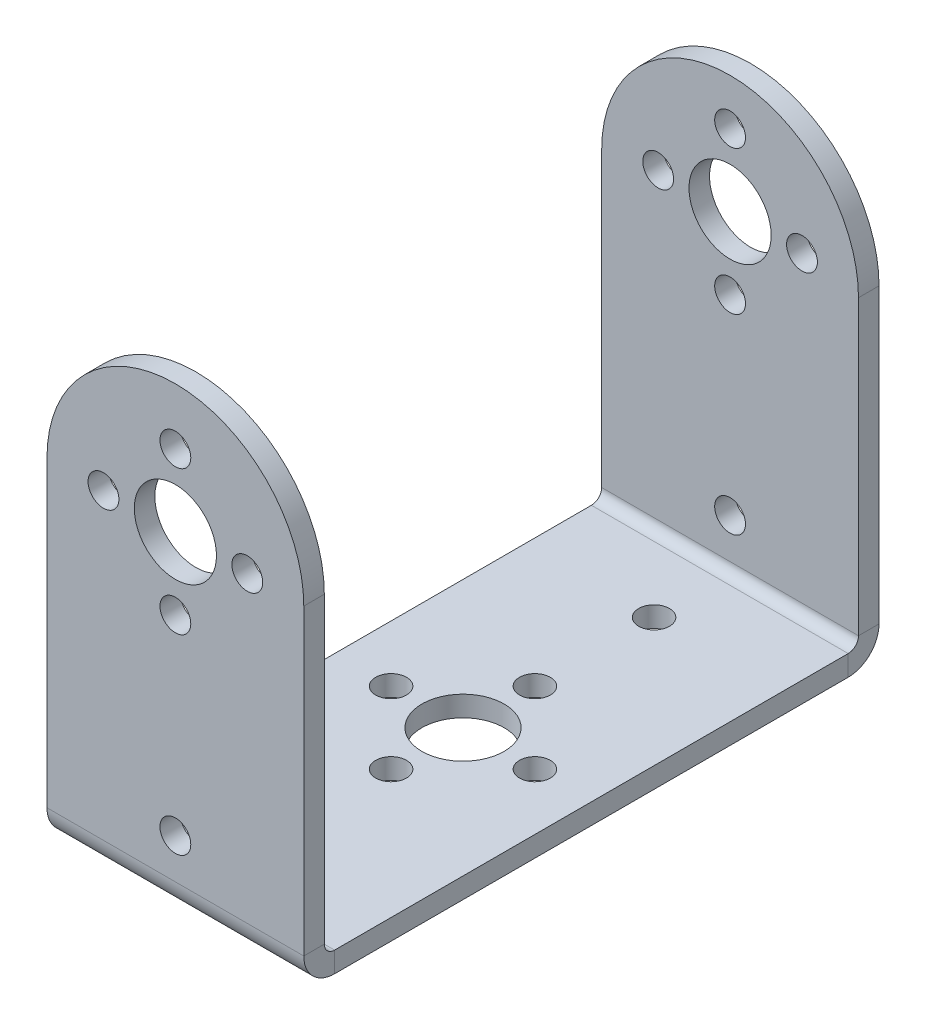
ISO-10303-21;
HEADER;
FILE_DESCRIPTION(('STEP AP214'),'2;1');
FILE_NAME('part.step','',(''),(''),'','','');
FILE_SCHEMA(('AUTOMOTIVE_DESIGN { 1 0 10303 214 1 1 1 1 }'));
ENDSEC;
DATA;
#1=APPLICATION_CONTEXT('core data for automotive mechanical design processes');
#2=APPLICATION_PROTOCOL_DEFINITION('international standard','automotive_design',2000,#1);
#3=PRODUCT_CONTEXT('',#1,'mechanical');
#4=PRODUCT('Part','Part','',(#3));
#5=PRODUCT_RELATED_PRODUCT_CATEGORY('part','',(#4));
#6=PRODUCT_DEFINITION_FORMATION('','',#4);
#7=PRODUCT_DEFINITION_CONTEXT('part definition',#1,'design');
#8=PRODUCT_DEFINITION('design','',#6,#7);
#9=PRODUCT_DEFINITION_SHAPE('','',#8);
#10=(LENGTH_UNIT() NAMED_UNIT(*) SI_UNIT(.MILLI.,.METRE.));
#11=(NAMED_UNIT(*) PLANE_ANGLE_UNIT() SI_UNIT($,.RADIAN.));
#12=(NAMED_UNIT(*) SI_UNIT($,.STERADIAN.) SOLID_ANGLE_UNIT());
#13=UNCERTAINTY_MEASURE_WITH_UNIT(LENGTH_MEASURE(1.E-05),#10,'distance_accuracy_value','');
#14=(GEOMETRIC_REPRESENTATION_CONTEXT(3) GLOBAL_UNCERTAINTY_ASSIGNED_CONTEXT((#13)) GLOBAL_UNIT_ASSIGNED_CONTEXT((#10,
#11,#12)) REPRESENTATION_CONTEXT('',''));
#15=CARTESIAN_POINT('',(0.,0.,0.));
#16=DIRECTION('',(0.,0.,1.));
#17=DIRECTION('',(1.,0.,0.));
#18=AXIS2_PLACEMENT_3D('',#15,#16,#17);
#19=CARTESIAN_POINT('',(0.,-3.88666196166363E-13,-56.));
#20=DIRECTION('',(0.,0.,1.));
#21=DIRECTION('',(0.,-1.,0.));
#22=AXIS2_PLACEMENT_3D('',#19,#20,#21);
#23=PLANE('',#22);
#24=CARTESIAN_POINT('',(0.,36.5,-56.0000000000004));
#25=DIRECTION('',(0.,0.,1.));
#26=DIRECTION('',(1.,0.,0.));
#27=AXIS2_PLACEMENT_3D('',#24,#25,#26);
#28=CIRCLE('',#27,1.49999999999999);
#29=CARTESIAN_POINT('',(1.49999999999999,36.5,-56.0000000000004));
#30=VERTEX_POINT('',#29);
#31=EDGE_CURVE('E428',#30,#30,#28,.T.);
#32=ORIENTED_EDGE('',*,*,#31,.T.);
#33=EDGE_LOOP('',(#32));
#34=FACE_BOUND('',#33,.T.);
#35=CARTESIAN_POINT('',(-7.,29.5,-56.0000000000004));
#36=DIRECTION('',(0.,0.,1.));
#37=DIRECTION('',(1.,0.,0.));
#38=AXIS2_PLACEMENT_3D('',#35,#36,#37);
#39=CIRCLE('',#38,1.49999999999999);
#40=CARTESIAN_POINT('',(-5.50000000000001,29.5,-56.0000000000004));
#41=VERTEX_POINT('',#40);
#42=EDGE_CURVE('E412',#41,#41,#39,.T.);
#43=ORIENTED_EDGE('',*,*,#42,.T.);
#44=EDGE_LOOP('',(#43));
#45=FACE_BOUND('',#44,.T.);
#46=CARTESIAN_POINT('',(0.,22.5,-56.0000000000004));
#47=DIRECTION('',(0.,0.,1.));
#48=DIRECTION('',(1.,0.,0.));
#49=AXIS2_PLACEMENT_3D('',#46,#47,#48);
#50=CIRCLE('',#49,1.49999999999999);
#51=CARTESIAN_POINT('',(1.49999999999999,22.5,-56.0000000000004));
#52=VERTEX_POINT('',#51);
#53=EDGE_CURVE('E396',#52,#52,#50,.T.);
#54=ORIENTED_EDGE('',*,*,#53,.T.);
#55=EDGE_LOOP('',(#54));
#56=FACE_BOUND('',#55,.T.);
#57=CARTESIAN_POINT('',(7.,29.5,-56.0000000000004));
#58=DIRECTION('',(0.,0.,1.));
#59=DIRECTION('',(1.,0.,0.));
#60=AXIS2_PLACEMENT_3D('',#57,#58,#59);
#61=CIRCLE('',#60,1.49999999999999);
#62=CARTESIAN_POINT('',(8.49999999999999,29.5,-56.0000000000004));
#63=VERTEX_POINT('',#62);
#64=EDGE_CURVE('E380',#63,#63,#61,.T.);
#65=ORIENTED_EDGE('',*,*,#64,.T.);
#66=EDGE_LOOP('',(#65));
#67=FACE_BOUND('',#66,.T.);
#68=CARTESIAN_POINT('',(0.,3.9,-56.0000000000004));
#69=DIRECTION('',(0.,0.,1.));
#70=DIRECTION('',(1.,0.,0.));
#71=AXIS2_PLACEMENT_3D('',#68,#69,#70);
#72=CIRCLE('',#71,1.49999999999999);
#73=CARTESIAN_POINT('',(1.49999999999999,3.9,-56.0000000000004));
#74=VERTEX_POINT('',#73);
#75=EDGE_CURVE('E364',#74,#74,#72,.T.);
#76=ORIENTED_EDGE('',*,*,#75,.T.);
#77=EDGE_LOOP('',(#76));
#78=FACE_BOUND('',#77,.T.);
#79=CARTESIAN_POINT('',(0.,29.5,-56.0000000000003));
#80=DIRECTION('',(0.,0.,1.));
#81=DIRECTION('',(1.,0.,0.));
#82=AXIS2_PLACEMENT_3D('',#79,#80,#81);
#83=CIRCLE('',#82,4.);
#84=CARTESIAN_POINT('',(4.,29.5,-56.0000000000003));
#85=VERTEX_POINT('',#84);
#86=EDGE_CURVE('E348',#85,#85,#83,.T.);
#87=ORIENTED_EDGE('',*,*,#86,.T.);
#88=EDGE_LOOP('',(#87));
#89=FACE_BOUND('',#88,.T.);
#90=DIRECTION('',(0.,1.,0.));
#91=VECTOR('',#90,1.);
#92=CARTESIAN_POINT('',(-12.5,40.9999999999998,-56.0000000000003));
#93=LINE('',#92,#91);
#94=CARTESIAN_POINT('',(-12.5,-1.73384210050123E-13,-56.));
#95=VERTEX_POINT('',#94);
#96=CARTESIAN_POINT('',(-12.5,28.4999999999998,-56.0000000000002));
#97=VERTEX_POINT('',#96);
#98=EDGE_CURVE('E297',#95,#97,#93,.T.);
#99=ORIENTED_EDGE('',*,*,#98,.T.);
#100=CARTESIAN_POINT('',(0.,28.4999999999998,-56.0000000000002));
#101=DIRECTION('',(0.,0.,1.));
#102=DIRECTION('',(0.,-1.,0.));
#103=AXIS2_PLACEMENT_3D('',#100,#101,#102);
#104=CIRCLE('',#103,12.5);
#105=CARTESIAN_POINT('',(12.5,28.4999999999998,-56.0000000000002));
#106=VERTEX_POINT('',#105);
#107=EDGE_CURVE('E328',#106,#97,#104,.T.);
#108=ORIENTED_EDGE('',*,*,#107,.F.);
#109=DIRECTION('',(0.,-1.,0.));
#110=VECTOR('',#109,1.);
#111=CARTESIAN_POINT('',(12.5,-1.00000000000019,-56.));
#112=LINE('',#111,#110);
#113=CARTESIAN_POINT('',(12.5,-2.15149779794903E-13,-56.));
#114=VERTEX_POINT('',#113);
#115=EDGE_CURVE('E277',#106,#114,#112,.T.);
#116=ORIENTED_EDGE('',*,*,#115,.T.);
#117=DIRECTION('',(1.,0.,0.));
#118=VECTOR('',#117,1.);
#119=CARTESIAN_POINT('',(0.,-1.73384210050123E-13,-56.));
#120=LINE('',#119,#118);
#121=EDGE_CURVE('E302',#95,#114,#120,.T.);
#122=ORIENTED_EDGE('',*,*,#121,.F.);
#123=EDGE_LOOP('',(#99,#108,#116,#122));
#124=FACE_BOUND('',#123,.T.);
#125=ADVANCED_FACE('F83',(#34,#45,#56,#67,#78,#89,#124),#23,.F.);
#126=CARTESIAN_POINT('',(0.,-3.7470027081099E-13,-54.));
#127=DIRECTION('',(0.,0.,1.));
#128=DIRECTION('',(0.,-1.,0.));
#129=AXIS2_PLACEMENT_3D('',#126,#127,#128);
#130=PLANE('',#129);
#131=CARTESIAN_POINT('',(0.,36.5,-54.0000000000003));
#132=DIRECTION('',(0.,0.,1.));
#133=DIRECTION('',(0.,-1.,0.));
#134=AXIS2_PLACEMENT_3D('',#131,#132,#133);
#135=CIRCLE('',#134,1.49999999999999);
#136=CARTESIAN_POINT('',(0.,35.,-54.0000000000003));
#137=VERTEX_POINT('',#136);
#138=EDGE_CURVE('E420',#137,#137,#135,.T.);
#139=ORIENTED_EDGE('',*,*,#138,.F.);
#140=EDGE_LOOP('',(#139));
#141=FACE_BOUND('',#140,.T.);
#142=CARTESIAN_POINT('',(-7.,29.5,-54.0000000000002));
#143=DIRECTION('',(0.,0.,1.));
#144=DIRECTION('',(0.,-1.,0.));
#145=AXIS2_PLACEMENT_3D('',#142,#143,#144);
#146=CIRCLE('',#145,1.49999999999999);
#147=CARTESIAN_POINT('',(-7.,28.,-54.0000000000002));
#148=VERTEX_POINT('',#147);
#149=EDGE_CURVE('E404',#148,#148,#146,.T.);
#150=ORIENTED_EDGE('',*,*,#149,.F.);
#151=EDGE_LOOP('',(#150));
#152=FACE_BOUND('',#151,.T.);
#153=CARTESIAN_POINT('',(0.,22.5,-54.0000000000002));
#154=DIRECTION('',(0.,0.,1.));
#155=DIRECTION('',(0.,-1.,0.));
#156=AXIS2_PLACEMENT_3D('',#153,#154,#155);
#157=CIRCLE('',#156,1.49999999999999);
#158=CARTESIAN_POINT('',(0.,21.,-54.0000000000002));
#159=VERTEX_POINT('',#158);
#160=EDGE_CURVE('E388',#159,#159,#157,.T.);
#161=ORIENTED_EDGE('',*,*,#160,.F.);
#162=EDGE_LOOP('',(#161));
#163=FACE_BOUND('',#162,.T.);
#164=CARTESIAN_POINT('',(7.,29.5,-54.0000000000002));
#165=DIRECTION('',(0.,0.,1.));
#166=DIRECTION('',(0.,-1.,0.));
#167=AXIS2_PLACEMENT_3D('',#164,#165,#166);
#168=CIRCLE('',#167,1.49999999999999);
#169=CARTESIAN_POINT('',(7.,28.,-54.0000000000002));
#170=VERTEX_POINT('',#169);
#171=EDGE_CURVE('E372',#170,#170,#168,.T.);
#172=ORIENTED_EDGE('',*,*,#171,.F.);
#173=EDGE_LOOP('',(#172));
#174=FACE_BOUND('',#173,.T.);
#175=CARTESIAN_POINT('',(0.,3.9,-54.));
#176=DIRECTION('',(0.,0.,1.));
#177=DIRECTION('',(0.,-1.,0.));
#178=AXIS2_PLACEMENT_3D('',#175,#176,#177);
#179=CIRCLE('',#178,1.49999999999999);
#180=CARTESIAN_POINT('',(0.,2.40000000000002,-54.));
#181=VERTEX_POINT('',#180);
#182=EDGE_CURVE('E353',#181,#181,#179,.T.);
#183=ORIENTED_EDGE('',*,*,#182,.F.);
#184=EDGE_LOOP('',(#183));
#185=FACE_BOUND('',#184,.T.);
#186=CARTESIAN_POINT('',(0.,29.5,-54.0000000000002));
#187=DIRECTION('',(0.,0.,1.));
#188=DIRECTION('',(0.,-1.,0.));
#189=AXIS2_PLACEMENT_3D('',#186,#187,#188);
#190=CIRCLE('',#189,4.);
#191=CARTESIAN_POINT('',(0.,25.5,-54.0000000000002));
#192=VERTEX_POINT('',#191);
#193=EDGE_CURVE('E340',#192,#192,#190,.T.);
#194=ORIENTED_EDGE('',*,*,#193,.F.);
#195=EDGE_LOOP('',(#194));
#196=FACE_BOUND('',#195,.T.);
#197=CARTESIAN_POINT('',(0.,28.4999999999998,-54.0000000000002));
#198=DIRECTION('',(0.,0.,1.));
#199=DIRECTION('',(0.,-1.,0.));
#200=AXIS2_PLACEMENT_3D('',#197,#198,#199);
#201=CIRCLE('',#200,12.5);
#202=CARTESIAN_POINT('',(12.5,28.4999999999998,-54.0000000000002));
#203=VERTEX_POINT('',#202);
#204=CARTESIAN_POINT('',(-12.5,28.4999999999998,-54.0000000000001));
#205=VERTEX_POINT('',#204);
#206=EDGE_CURVE('E329',#203,#205,#201,.T.);
#207=ORIENTED_EDGE('',*,*,#206,.T.);
#208=DIRECTION('',(0.,1.,0.));
#209=VECTOR('',#208,1.);
#210=CARTESIAN_POINT('',(-12.5,40.9999999999998,-54.0000000000003));
#211=LINE('',#210,#209);
#212=CARTESIAN_POINT('',(-12.5,-2.01271991987089E-13,-54.));
#213=VERTEX_POINT('',#212);
#214=EDGE_CURVE('E298',#213,#205,#211,.T.);
#215=ORIENTED_EDGE('',*,*,#214,.F.);
#216=DIRECTION('',(-1.,0.,0.));
#217=VECTOR('',#216,1.);
#218=CARTESIAN_POINT('',(12.5,-1.87350135405495E-13,-54.));
#219=LINE('',#218,#217);
#220=CARTESIAN_POINT('',(12.5,-2.01271991987089E-13,-54.));
#221=VERTEX_POINT('',#220);
#222=EDGE_CURVE('E317',#221,#213,#219,.T.);
#223=ORIENTED_EDGE('',*,*,#222,.F.);
#224=DIRECTION('',(0.,-1.,0.));
#225=VECTOR('',#224,1.);
#226=CARTESIAN_POINT('',(12.5,-1.00000000000018,-54.));
#227=LINE('',#226,#225);
#228=EDGE_CURVE('E293',#203,#221,#227,.T.);
#229=ORIENTED_EDGE('',*,*,#228,.F.);
#230=EDGE_LOOP('',(#207,#215,#223,#229));
#231=FACE_BOUND('',#230,.T.);
#232=ADVANCED_FACE('F550',(#141,#152,#163,#174,#185,#196,#231),#130,.T.);
#233=CARTESIAN_POINT('',(-12.5,40.9999999999998,-56.0000000000003));
#234=DIRECTION('',(1.,0.,0.));
#235=DIRECTION('',(0.,1.,0.));
#236=AXIS2_PLACEMENT_3D('',#233,#234,#235);
#237=PLANE('',#236);
#238=DIRECTION('',(0.,0.,1.));
#239=VECTOR('',#238,1.);
#240=CARTESIAN_POINT('',(-12.5,28.4999999999998,-54.0000000000001));
#241=LINE('',#240,#239);
#242=EDGE_CURVE('E333',#205,#97,#241,.F.);
#243=ORIENTED_EDGE('',*,*,#242,.T.);
#244=ORIENTED_EDGE('',*,*,#98,.F.);
#245=DIRECTION('',(0.,0.,-1.));
#246=VECTOR('',#245,1.);
#247=CARTESIAN_POINT('',(-12.5,-1.87350135405495E-13,-54.));
#248=LINE('',#247,#246);
#249=EDGE_CURVE('E312',#213,#95,#248,.T.);
#250=ORIENTED_EDGE('',*,*,#249,.F.);
#251=ORIENTED_EDGE('',*,*,#214,.T.);
#252=EDGE_LOOP('',(#243,#244,#250,#251));
#253=FACE_BOUND('',#252,.T.);
#254=ADVANCED_FACE('F556',(#253),#237,.F.);
#255=CARTESIAN_POINT('',(-12.5,-3.00000000000018,-54.));
#256=DIRECTION('',(1.,0.,0.));
#257=DIRECTION('',(0.,0.,-1.));
#258=AXIS2_PLACEMENT_3D('',#255,#256,#257);
#259=PLANE('',#258);
#260=DIRECTION('',(0.,-1.,0.));
#261=VECTOR('',#260,1.);
#262=CARTESIAN_POINT('',(-12.5,-1.0000000000002,-53.));
#263=LINE('',#262,#261);
#264=CARTESIAN_POINT('',(-12.5,-1.00000000000017,-53.));
#265=VERTEX_POINT('',#264);
#266=CARTESIAN_POINT('',(-12.5,-3.0000000000002,-53.));
#267=VERTEX_POINT('',#266);
#268=EDGE_CURVE('E258',#265,#267,#263,.T.);
#269=ORIENTED_EDGE('',*,*,#268,.T.);
#270=DIRECTION('',(0.,0.,-1.));
#271=VECTOR('',#270,1.);
#272=CARTESIAN_POINT('',(-12.5,-2.99999999999999,0.));
#273=LINE('',#272,#271);
#274=CARTESIAN_POINT('',(-12.5,-3.,-2.99999999999999));
#275=VERTEX_POINT('',#274);
#276=EDGE_CURVE('E246',#275,#267,#273,.T.);
#277=ORIENTED_EDGE('',*,*,#276,.F.);
#278=DIRECTION('',(0.,1.,0.));
#279=VECTOR('',#278,1.);
#280=CARTESIAN_POINT('',(-12.5,-1.,-3.));
#281=LINE('',#280,#279);
#282=CARTESIAN_POINT('',(-12.5,-1.,-3.));
#283=VERTEX_POINT('',#282);
#284=EDGE_CURVE('E187',#283,#275,#281,.F.);
#285=ORIENTED_EDGE('',*,*,#284,.F.);
#286=DIRECTION('',(0.,0.,1.));
#287=VECTOR('',#286,1.);
#288=CARTESIAN_POINT('',(-12.5,-1.00000000000018,-54.));
#289=LINE('',#288,#287);
#290=EDGE_CURVE('E249',#283,#265,#289,.F.);
#291=ORIENTED_EDGE('',*,*,#290,.T.);
#292=EDGE_LOOP('',(#269,#277,#285,#291));
#293=FACE_BOUND('',#292,.T.);
#294=ADVANCED_FACE('F585',(#293),#259,.F.);
#295=CARTESIAN_POINT('',(12.5,-3.,-1.99999999999999));
#296=DIRECTION('',(-1.,0.,0.));
#297=DIRECTION('',(0.,0.,1.));
#298=AXIS2_PLACEMENT_3D('',#295,#296,#297);
#299=PLANE('',#298);
#300=DIRECTION('',(0.,-1.,0.));
#301=VECTOR('',#300,1.);
#302=CARTESIAN_POINT('',(12.5,-1.0000000000002,-53.));
#303=LINE('',#302,#301);
#304=CARTESIAN_POINT('',(12.5,-1.0000000000002,-53.));
#305=VERTEX_POINT('',#304);
#306=CARTESIAN_POINT('',(12.5,-3.00000000000018,-53.));
#307=VERTEX_POINT('',#306);
#308=EDGE_CURVE('E254',#305,#307,#303,.T.);
#309=ORIENTED_EDGE('',*,*,#308,.F.);
#310=DIRECTION('',(0.,0.,-1.));
#311=VECTOR('',#310,1.);
#312=CARTESIAN_POINT('',(12.5,-0.999999999999997,-2.));
#313=LINE('',#312,#311);
#314=CARTESIAN_POINT('',(12.5,-1.,-3.));
#315=VERTEX_POINT('',#314);
#316=EDGE_CURVE('E227',#305,#315,#313,.F.);
#317=ORIENTED_EDGE('',*,*,#316,.T.);
#318=DIRECTION('',(0.,1.,0.));
#319=VECTOR('',#318,1.);
#320=CARTESIAN_POINT('',(12.5,-3.,-2.99999999999999));
#321=LINE('',#320,#319);
#322=CARTESIAN_POINT('',(12.5,-3.,-2.99999999999999));
#323=VERTEX_POINT('',#322);
#324=EDGE_CURVE('E217',#315,#323,#321,.F.);
#325=ORIENTED_EDGE('',*,*,#324,.T.);
#326=DIRECTION('',(0.,0.,1.));
#327=VECTOR('',#326,1.);
#328=CARTESIAN_POINT('',(12.5,-2.99999999999999,0.));
#329=LINE('',#328,#327);
#330=EDGE_CURVE('E201',#307,#323,#329,.T.);
#331=ORIENTED_EDGE('',*,*,#330,.F.);
#332=EDGE_LOOP('',(#309,#317,#325,#331));
#333=FACE_BOUND('',#332,.T.);
#334=ADVANCED_FACE('F251',(#333),#299,.F.);
#335=CARTESIAN_POINT('',(0.,-2.99999999999999,0.));
#336=DIRECTION('',(0.,1.,0.));
#337=DIRECTION('',(0.,0.,1.));
#338=AXIS2_PLACEMENT_3D('',#335,#336,#337);
#339=PLANE('',#338);
#340=CARTESIAN_POINT('',(7.,-3.00000000000037,-28.));
#341=DIRECTION('',(0.,1.,0.));
#342=DIRECTION('',(0.,0.,1.));
#343=AXIS2_PLACEMENT_3D('',#340,#341,#342);
#344=CIRCLE('',#343,1.5);
#345=CARTESIAN_POINT('',(7.,-3.00000000000036,-26.5));
#346=VERTEX_POINT('',#345);
#347=EDGE_CURVE('E484',#346,#346,#344,.T.);
#348=ORIENTED_EDGE('',*,*,#347,.T.);
#349=EDGE_LOOP('',(#348));
#350=FACE_BOUND('',#349,.T.);
#351=CARTESIAN_POINT('',(-7.,-3.00000000000037,-28.));
#352=DIRECTION('',(0.,1.,0.));
#353=DIRECTION('',(0.,0.,1.));
#354=AXIS2_PLACEMENT_3D('',#351,#352,#353);
#355=CIRCLE('',#354,1.5);
#356=CARTESIAN_POINT('',(-7.,-3.00000000000036,-26.5));
#357=VERTEX_POINT('',#356);
#358=EDGE_CURVE('E476',#357,#357,#355,.T.);
#359=ORIENTED_EDGE('',*,*,#358,.T.);
#360=EDGE_LOOP('',(#359));
#361=FACE_BOUND('',#360,.T.);
#362=CARTESIAN_POINT('',(0.,-3.00000000000039,-35.));
#363=DIRECTION('',(0.,1.,0.));
#364=DIRECTION('',(0.,0.,1.));
#365=AXIS2_PLACEMENT_3D('',#362,#363,#364);
#366=CIRCLE('',#365,1.5);
#367=CARTESIAN_POINT('',(0.,-3.00000000000039,-33.5));
#368=VERTEX_POINT('',#367);
#369=EDGE_CURVE('E468',#368,#368,#366,.T.);
#370=ORIENTED_EDGE('',*,*,#369,.T.);
#371=EDGE_LOOP('',(#370));
#372=FACE_BOUND('',#371,.T.);
#373=CARTESIAN_POINT('',(0.,-3.00000000000034,-21.));
#374=DIRECTION('',(0.,1.,0.));
#375=DIRECTION('',(0.,0.,1.));
#376=AXIS2_PLACEMENT_3D('',#373,#374,#375);
#377=CIRCLE('',#376,1.5);
#378=CARTESIAN_POINT('',(0.,-3.00000000000034,-19.5));
#379=VERTEX_POINT('',#378);
#380=EDGE_CURVE('E460',#379,#379,#377,.T.);
#381=ORIENTED_EDGE('',*,*,#380,.T.);
#382=EDGE_LOOP('',(#381));
#383=FACE_BOUND('',#382,.T.);
#384=CARTESIAN_POINT('',(0.,-3.0000000000003,-9.4));
#385=DIRECTION('',(0.,1.,0.));
#386=DIRECTION('',(0.,0.,1.));
#387=AXIS2_PLACEMENT_3D('',#384,#385,#386);
#388=CIRCLE('',#387,1.5);
#389=CARTESIAN_POINT('',(0.,-3.0000000000003,-7.9));
#390=VERTEX_POINT('',#389);
#391=EDGE_CURVE('E452',#390,#390,#388,.T.);
#392=ORIENTED_EDGE('',*,*,#391,.T.);
#393=EDGE_LOOP('',(#392));
#394=FACE_BOUND('',#393,.T.);
#395=CARTESIAN_POINT('',(0.,-3.00000000000043,-46.6));
#396=DIRECTION('',(0.,1.,0.));
#397=DIRECTION('',(0.,0.,1.));
#398=AXIS2_PLACEMENT_3D('',#395,#396,#397);
#399=CIRCLE('',#398,1.5);
#400=CARTESIAN_POINT('',(0.,-3.00000000000043,-45.1));
#401=VERTEX_POINT('',#400);
#402=EDGE_CURVE('E441',#401,#401,#399,.T.);
#403=ORIENTED_EDGE('',*,*,#402,.T.);
#404=EDGE_LOOP('',(#403));
#405=FACE_BOUND('',#404,.T.);
#406=CARTESIAN_POINT('',(0.,-3.00000000000029,-28.));
#407=DIRECTION('',(0.,1.,0.));
#408=DIRECTION('',(0.,0.,1.));
#409=AXIS2_PLACEMENT_3D('',#406,#407,#408);
#410=CIRCLE('',#409,4.);
#411=CARTESIAN_POINT('',(0.,-3.00000000000028,-24.));
#412=VERTEX_POINT('',#411);
#413=EDGE_CURVE('E436',#412,#412,#410,.T.);
#414=ORIENTED_EDGE('',*,*,#413,.T.);
#415=EDGE_LOOP('',(#414));
#416=FACE_BOUND('',#415,.T.);
#417=DIRECTION('',(-1.,0.,0.));
#418=VECTOR('',#417,1.);
#419=CARTESIAN_POINT('',(-12.5,-3.0000000000002,-53.));
#420=LINE('',#419,#418);
#421=EDGE_CURVE('E243',#267,#307,#420,.F.);
#422=ORIENTED_EDGE('',*,*,#421,.T.);
#423=ORIENTED_EDGE('',*,*,#330,.T.);
#424=DIRECTION('',(-1.,0.,0.));
#425=VECTOR('',#424,1.);
#426=CARTESIAN_POINT('',(12.5,-3.,-2.99999999999999));
#427=LINE('',#426,#425);
#428=EDGE_CURVE('E240',#275,#323,#427,.F.);
#429=ORIENTED_EDGE('',*,*,#428,.F.);
#430=ORIENTED_EDGE('',*,*,#276,.T.);
#431=EDGE_LOOP('',(#422,#423,#429,#430));
#432=FACE_BOUND('',#431,.T.);
#433=ADVANCED_FACE('F238',(#350,#361,#372,#383,#394,#405,#416,#432),#339,.F.);
#434=CARTESIAN_POINT('',(0.,-0.99999999999999,0.));
#435=DIRECTION('',(0.,1.,0.));
#436=DIRECTION('',(0.,0.,1.));
#437=AXIS2_PLACEMENT_3D('',#434,#435,#436);
#438=PLANE('',#437);
#439=CARTESIAN_POINT('',(7.,-1.00000000000009,-28.));
#440=DIRECTION('',(0.,1.,0.));
#441=DIRECTION('',(0.,0.,1.));
#442=AXIS2_PLACEMENT_3D('',#439,#440,#441);
#443=CIRCLE('',#442,1.49999999999999);
#444=CARTESIAN_POINT('',(7.,-1.00000000000008,-26.5));
#445=VERTEX_POINT('',#444);
#446=EDGE_CURVE('E488',#445,#445,#443,.T.);
#447=ORIENTED_EDGE('',*,*,#446,.F.);
#448=EDGE_LOOP('',(#447));
#449=FACE_BOUND('',#448,.T.);
#450=CARTESIAN_POINT('',(-7.,-1.00000000000009,-28.));
#451=DIRECTION('',(0.,1.,0.));
#452=DIRECTION('',(0.,0.,1.));
#453=AXIS2_PLACEMENT_3D('',#450,#451,#452);
#454=CIRCLE('',#453,1.49999999999999);
#455=CARTESIAN_POINT('',(-7.,-1.00000000000008,-26.5));
#456=VERTEX_POINT('',#455);
#457=EDGE_CURVE('E480',#456,#456,#454,.T.);
#458=ORIENTED_EDGE('',*,*,#457,.F.);
#459=EDGE_LOOP('',(#458));
#460=FACE_BOUND('',#459,.T.);
#461=CARTESIAN_POINT('',(0.,-1.00000000000011,-35.));
#462=DIRECTION('',(0.,1.,0.));
#463=DIRECTION('',(0.,0.,1.));
#464=AXIS2_PLACEMENT_3D('',#461,#462,#463);
#465=CIRCLE('',#464,1.49999999999999);
#466=CARTESIAN_POINT('',(0.,-1.00000000000011,-33.5));
#467=VERTEX_POINT('',#466);
#468=EDGE_CURVE('E472',#467,#467,#465,.T.);
#469=ORIENTED_EDGE('',*,*,#468,.F.);
#470=EDGE_LOOP('',(#469));
#471=FACE_BOUND('',#470,.T.);
#472=CARTESIAN_POINT('',(0.,-1.00000000000006,-21.));
#473=DIRECTION('',(0.,1.,0.));
#474=DIRECTION('',(0.,0.,1.));
#475=AXIS2_PLACEMENT_3D('',#472,#473,#474);
#476=CIRCLE('',#475,1.49999999999999);
#477=CARTESIAN_POINT('',(0.,-1.00000000000006,-19.5));
#478=VERTEX_POINT('',#477);
#479=EDGE_CURVE('E464',#478,#478,#476,.T.);
#480=ORIENTED_EDGE('',*,*,#479,.F.);
#481=EDGE_LOOP('',(#480));
#482=FACE_BOUND('',#481,.T.);
#483=CARTESIAN_POINT('',(0.,-1.00000000000002,-9.4));
#484=DIRECTION('',(0.,1.,0.));
#485=DIRECTION('',(0.,0.,1.));
#486=AXIS2_PLACEMENT_3D('',#483,#484,#485);
#487=CIRCLE('',#486,1.49999999999999);
#488=CARTESIAN_POINT('',(0.,-1.00000000000002,-7.90000000000001));
#489=VERTEX_POINT('',#488);
#490=EDGE_CURVE('E456',#489,#489,#487,.T.);
#491=ORIENTED_EDGE('',*,*,#490,.F.);
#492=EDGE_LOOP('',(#491));
#493=FACE_BOUND('',#492,.T.);
#494=CARTESIAN_POINT('',(0.,-1.00000000000015,-46.6));
#495=DIRECTION('',(0.,1.,0.));
#496=DIRECTION('',(0.,0.,1.));
#497=AXIS2_PLACEMENT_3D('',#494,#495,#496);
#498=CIRCLE('',#497,1.49999999999999);
#499=CARTESIAN_POINT('',(0.,-1.00000000000015,-45.1));
#500=VERTEX_POINT('',#499);
#501=EDGE_CURVE('E448',#500,#500,#498,.T.);
#502=ORIENTED_EDGE('',*,*,#501,.F.);
#503=EDGE_LOOP('',(#502));
#504=FACE_BOUND('',#503,.T.);
#505=CARTESIAN_POINT('',(0.,-1.00000000000009,-28.));
#506=DIRECTION('',(0.,1.,0.));
#507=DIRECTION('',(0.,0.,1.));
#508=AXIS2_PLACEMENT_3D('',#505,#506,#507);
#509=CIRCLE('',#508,4.);
#510=CARTESIAN_POINT('',(0.,-1.00000000000007,-24.));
#511=VERTEX_POINT('',#510);
#512=EDGE_CURVE('E437',#511,#511,#509,.T.);
#513=ORIENTED_EDGE('',*,*,#512,.F.);
#514=EDGE_LOOP('',(#513));
#515=FACE_BOUND('',#514,.T.);
#516=ORIENTED_EDGE('',*,*,#316,.F.);
#517=DIRECTION('',(-1.,0.,0.));
#518=VECTOR('',#517,1.);
#519=CARTESIAN_POINT('',(-12.5,-1.0000000000002,-53.));
#520=LINE('',#519,#518);
#521=EDGE_CURVE('E101',#265,#305,#520,.F.);
#522=ORIENTED_EDGE('',*,*,#521,.F.);
#523=ORIENTED_EDGE('',*,*,#290,.F.);
#524=DIRECTION('',(-1.,0.,0.));
#525=VECTOR('',#524,1.);
#526=CARTESIAN_POINT('',(12.5,-1.,-3.));
#527=LINE('',#526,#525);
#528=EDGE_CURVE('E253',#315,#283,#527,.T.);
#529=ORIENTED_EDGE('',*,*,#528,.F.);
#530=EDGE_LOOP('',(#516,#522,#523,#529));
#531=FACE_BOUND('',#530,.T.);
#532=ADVANCED_FACE('F495',(#449,#460,#471,#482,#493,#504,#515,#531),#438,.T.);
#533=CARTESIAN_POINT('',(-12.5,0.,-2.));
#534=DIRECTION('',(-1.,0.,0.));
#535=DIRECTION('',(0.,-1.,0.));
#536=AXIS2_PLACEMENT_3D('',#533,#534,#535);
#537=PLANE('',#536);
#538=DIRECTION('',(0.,-1.,0.));
#539=VECTOR('',#538,1.);
#540=CARTESIAN_POINT('',(-12.5,0.,0.));
#541=LINE('',#540,#539);
#542=CARTESIAN_POINT('',(-12.5,29.5,0.));
#543=VERTEX_POINT('',#542);
#544=CARTESIAN_POINT('',(-12.5,0.,0.));
#545=VERTEX_POINT('',#544);
#546=EDGE_CURVE('E131',#543,#545,#541,.T.);
#547=ORIENTED_EDGE('',*,*,#546,.F.);
#548=DIRECTION('',(0.,0.,1.));
#549=VECTOR('',#548,1.);
#550=CARTESIAN_POINT('',(-12.5,29.5,-2.));
#551=LINE('',#550,#549);
#552=CARTESIAN_POINT('',(-12.5,29.5,-2.));
#553=VERTEX_POINT('',#552);
#554=EDGE_CURVE('E13',#553,#543,#551,.T.);
#555=ORIENTED_EDGE('',*,*,#554,.F.);
#556=DIRECTION('',(0.,-1.,0.));
#557=VECTOR('',#556,1.);
#558=CARTESIAN_POINT('',(-12.5,0.,-2.));
#559=LINE('',#558,#557);
#560=CARTESIAN_POINT('',(-12.5,0.,-2.));
#561=VERTEX_POINT('',#560);
#562=EDGE_CURVE('E144',#553,#561,#559,.T.);
#563=ORIENTED_EDGE('',*,*,#562,.T.);
#564=DIRECTION('',(0.,0.,1.));
#565=VECTOR('',#564,1.);
#566=CARTESIAN_POINT('',(-12.5,0.,-2.));
#567=LINE('',#566,#565);
#568=EDGE_CURVE('E87',#561,#545,#567,.T.);
#569=ORIENTED_EDGE('',*,*,#568,.T.);
#570=EDGE_LOOP('',(#547,#555,#563,#569));
#571=FACE_BOUND('',#570,.T.);
#572=ADVANCED_FACE('F85',(#571),#537,.T.);
#573=CARTESIAN_POINT('',(0.,29.5,-2.));
#574=DIRECTION('',(0.,0.,1.));
#575=DIRECTION('',(1.,0.,0.));
#576=AXIS2_PLACEMENT_3D('',#573,#574,#575);
#577=CYLINDRICAL_SURFACE('',#576,12.5);
#578=CARTESIAN_POINT('',(0.,29.5,0.));
#579=DIRECTION('',(0.,0.,1.));
#580=DIRECTION('',(-1.,0.,0.));
#581=AXIS2_PLACEMENT_3D('',#578,#579,#580);
#582=CIRCLE('',#581,12.5);
#583=CARTESIAN_POINT('',(12.5,29.5,0.));
#584=VERTEX_POINT('',#583);
#585=EDGE_CURVE('E126',#584,#543,#582,.T.);
#586=ORIENTED_EDGE('',*,*,#585,.F.);
#587=DIRECTION('',(0.,0.,1.));
#588=VECTOR('',#587,1.);
#589=CARTESIAN_POINT('',(12.5,29.5,-2.));
#590=LINE('',#589,#588);
#591=CARTESIAN_POINT('',(12.5,29.5,-2.));
#592=VERTEX_POINT('',#591);
#593=EDGE_CURVE('E93',#592,#584,#590,.T.);
#594=ORIENTED_EDGE('',*,*,#593,.F.);
#595=CARTESIAN_POINT('',(0.,29.5,-2.));
#596=DIRECTION('',(0.,0.,1.));
#597=DIRECTION('',(-1.,0.,0.));
#598=AXIS2_PLACEMENT_3D('',#595,#596,#597);
#599=CIRCLE('',#598,12.5);
#600=EDGE_CURVE('E128',#592,#553,#599,.T.);
#601=ORIENTED_EDGE('',*,*,#600,.T.);
#602=ORIENTED_EDGE('',*,*,#554,.T.);
#603=EDGE_LOOP('',(#586,#594,#601,#602));
#604=FACE_BOUND('',#603,.T.);
#605=ADVANCED_FACE('F124',(#604),#577,.T.);
#606=CARTESIAN_POINT('',(12.5,0.,-2.));
#607=DIRECTION('',(1.,0.,0.));
#608=DIRECTION('',(0.,1.,0.));
#609=AXIS2_PLACEMENT_3D('',#606,#607,#608);
#610=PLANE('',#609);
#611=DIRECTION('',(0.,1.,0.));
#612=VECTOR('',#611,1.);
#613=CARTESIAN_POINT('',(12.5,0.,0.));
#614=LINE('',#613,#612);
#615=CARTESIAN_POINT('',(12.5,0.,0.));
#616=VERTEX_POINT('',#615);
#617=EDGE_CURVE('E142',#616,#584,#614,.T.);
#618=ORIENTED_EDGE('',*,*,#617,.F.);
#619=DIRECTION('',(0.,0.,1.));
#620=VECTOR('',#619,1.);
#621=CARTESIAN_POINT('',(12.5,0.,-2.));
#622=LINE('',#621,#620);
#623=CARTESIAN_POINT('',(12.5,0.,-2.));
#624=VERTEX_POINT('',#623);
#625=EDGE_CURVE('E154',#624,#616,#622,.T.);
#626=ORIENTED_EDGE('',*,*,#625,.F.);
#627=DIRECTION('',(0.,1.,0.));
#628=VECTOR('',#627,1.);
#629=CARTESIAN_POINT('',(12.5,0.,-2.));
#630=LINE('',#629,#628);
#631=EDGE_CURVE('E163',#624,#592,#630,.T.);
#632=ORIENTED_EDGE('',*,*,#631,.T.);
#633=ORIENTED_EDGE('',*,*,#593,.T.);
#634=EDGE_LOOP('',(#618,#626,#632,#633));
#635=FACE_BOUND('',#634,.T.);
#636=ADVANCED_FACE('F219',(#635),#610,.T.);
#637=CARTESIAN_POINT('',(0.,29.5,-2.));
#638=DIRECTION('',(0.,0.,-1.));
#639=DIRECTION('',(-1.,0.,0.));
#640=AXIS2_PLACEMENT_3D('',#637,#638,#639);
#641=PLANE('',#640);
#642=CARTESIAN_POINT('',(0.,36.5,-2.));
#643=DIRECTION('',(0.,0.,-1.));
#644=DIRECTION('',(-1.,0.,0.));
#645=AXIS2_PLACEMENT_3D('',#642,#643,#644);
#646=CIRCLE('',#645,1.49999999999999);
#647=CARTESIAN_POINT('',(-1.49999999999998,36.5,-2.));
#648=VERTEX_POINT('',#647);
#649=EDGE_CURVE('E424',#648,#648,#646,.T.);
#650=ORIENTED_EDGE('',*,*,#649,.F.);
#651=EDGE_LOOP('',(#650));
#652=FACE_BOUND('',#651,.T.);
#653=CARTESIAN_POINT('',(-7.,29.5,-2.));
#654=DIRECTION('',(0.,0.,-1.));
#655=DIRECTION('',(-1.,0.,0.));
#656=AXIS2_PLACEMENT_3D('',#653,#654,#655);
#657=CIRCLE('',#656,1.49999999999999);
#658=CARTESIAN_POINT('',(-8.49999999999999,29.5,-2.));
#659=VERTEX_POINT('',#658);
#660=EDGE_CURVE('E408',#659,#659,#657,.T.);
#661=ORIENTED_EDGE('',*,*,#660,.F.);
#662=EDGE_LOOP('',(#661));
#663=FACE_BOUND('',#662,.T.);
#664=CARTESIAN_POINT('',(0.,22.5,-2.));
#665=DIRECTION('',(0.,0.,-1.));
#666=DIRECTION('',(-1.,0.,0.));
#667=AXIS2_PLACEMENT_3D('',#664,#665,#666);
#668=CIRCLE('',#667,1.49999999999999);
#669=CARTESIAN_POINT('',(-1.49999999999998,22.5,-2.));
#670=VERTEX_POINT('',#669);
#671=EDGE_CURVE('E392',#670,#670,#668,.T.);
#672=ORIENTED_EDGE('',*,*,#671,.F.);
#673=EDGE_LOOP('',(#672));
#674=FACE_BOUND('',#673,.T.);
#675=CARTESIAN_POINT('',(7.,29.5,-2.));
#676=DIRECTION('',(0.,0.,-1.));
#677=DIRECTION('',(-1.,0.,0.));
#678=AXIS2_PLACEMENT_3D('',#675,#676,#677);
#679=CIRCLE('',#678,1.49999999999999);
#680=CARTESIAN_POINT('',(5.50000000000001,29.5,-2.));
#681=VERTEX_POINT('',#680);
#682=EDGE_CURVE('E376',#681,#681,#679,.T.);
#683=ORIENTED_EDGE('',*,*,#682,.F.);
#684=EDGE_LOOP('',(#683));
#685=FACE_BOUND('',#684,.T.);
#686=CARTESIAN_POINT('',(0.,3.9,-2.));
#687=DIRECTION('',(0.,0.,-1.));
#688=DIRECTION('',(-1.,0.,0.));
#689=AXIS2_PLACEMENT_3D('',#686,#687,#688);
#690=CIRCLE('',#689,1.49999999999999);
#691=CARTESIAN_POINT('',(-1.49999999999998,3.9,-2.));
#692=VERTEX_POINT('',#691);
#693=EDGE_CURVE('E360',#692,#692,#690,.T.);
#694=ORIENTED_EDGE('',*,*,#693,.F.);
#695=EDGE_LOOP('',(#694));
#696=FACE_BOUND('',#695,.T.);
#697=CARTESIAN_POINT('',(0.,29.5,-2.));
#698=DIRECTION('',(0.,0.,-1.));
#699=DIRECTION('',(-1.,0.,0.));
#700=AXIS2_PLACEMENT_3D('',#697,#698,#699);
#701=CIRCLE('',#700,4.);
#702=CARTESIAN_POINT('',(-4.,29.5,-2.));
#703=VERTEX_POINT('',#702);
#704=EDGE_CURVE('E344',#703,#703,#701,.T.);
#705=ORIENTED_EDGE('',*,*,#704,.F.);
#706=EDGE_LOOP('',(#705));
#707=FACE_BOUND('',#706,.T.);
#708=ORIENTED_EDGE('',*,*,#562,.F.);
#709=ORIENTED_EDGE('',*,*,#600,.F.);
#710=ORIENTED_EDGE('',*,*,#631,.F.);
#711=DIRECTION('',(1.,0.,0.));
#712=VECTOR('',#711,1.);
#713=CARTESIAN_POINT('',(-12.5,0.,-2.));
#714=LINE('',#713,#712);
#715=EDGE_CURVE('E148',#561,#624,#714,.T.);
#716=ORIENTED_EDGE('',*,*,#715,.F.);
#717=EDGE_LOOP('',(#708,#709,#710,#716));
#718=FACE_BOUND('',#717,.T.);
#719=ADVANCED_FACE('F220',(#652,#663,#674,#685,#696,#707,#718),#641,.T.);
#720=CARTESIAN_POINT('',(0.,29.5,0.));
#721=DIRECTION('',(0.,0.,-1.));
#722=DIRECTION('',(-1.,0.,0.));
#723=AXIS2_PLACEMENT_3D('',#720,#721,#722);
#724=PLANE('',#723);
#725=CARTESIAN_POINT('',(0.,36.5,0.));
#726=DIRECTION('',(0.,0.,1.));
#727=DIRECTION('',(1.,0.,0.));
#728=AXIS2_PLACEMENT_3D('',#725,#726,#727);
#729=CIRCLE('',#728,1.49999999999999);
#730=CARTESIAN_POINT('',(1.49999999999999,36.5,0.));
#731=VERTEX_POINT('',#730);
#732=EDGE_CURVE('E432',#731,#731,#729,.T.);
#733=ORIENTED_EDGE('',*,*,#732,.F.);
#734=EDGE_LOOP('',(#733));
#735=FACE_BOUND('',#734,.T.);
#736=CARTESIAN_POINT('',(-7.,29.5,0.));
#737=DIRECTION('',(0.,0.,1.));
#738=DIRECTION('',(1.,0.,0.));
#739=AXIS2_PLACEMENT_3D('',#736,#737,#738);
#740=CIRCLE('',#739,1.49999999999999);
#741=CARTESIAN_POINT('',(-5.50000000000001,29.5,0.));
#742=VERTEX_POINT('',#741);
#743=EDGE_CURVE('E416',#742,#742,#740,.T.);
#744=ORIENTED_EDGE('',*,*,#743,.F.);
#745=EDGE_LOOP('',(#744));
#746=FACE_BOUND('',#745,.T.);
#747=CARTESIAN_POINT('',(0.,22.5,0.));
#748=DIRECTION('',(0.,0.,1.));
#749=DIRECTION('',(1.,0.,0.));
#750=AXIS2_PLACEMENT_3D('',#747,#748,#749);
#751=CIRCLE('',#750,1.49999999999999);
#752=CARTESIAN_POINT('',(1.49999999999999,22.5,0.));
#753=VERTEX_POINT('',#752);
#754=EDGE_CURVE('E400',#753,#753,#751,.T.);
#755=ORIENTED_EDGE('',*,*,#754,.F.);
#756=EDGE_LOOP('',(#755));
#757=FACE_BOUND('',#756,.T.);
#758=CARTESIAN_POINT('',(7.,29.5,0.));
#759=DIRECTION('',(0.,0.,1.));
#760=DIRECTION('',(1.,0.,0.));
#761=AXIS2_PLACEMENT_3D('',#758,#759,#760);
#762=CIRCLE('',#761,1.49999999999999);
#763=CARTESIAN_POINT('',(8.49999999999999,29.5,0.));
#764=VERTEX_POINT('',#763);
#765=EDGE_CURVE('E384',#764,#764,#762,.T.);
#766=ORIENTED_EDGE('',*,*,#765,.F.);
#767=EDGE_LOOP('',(#766));
#768=FACE_BOUND('',#767,.T.);
#769=CARTESIAN_POINT('',(0.,3.9,0.));
#770=DIRECTION('',(0.,0.,1.));
#771=DIRECTION('',(1.,0.,0.));
#772=AXIS2_PLACEMENT_3D('',#769,#770,#771);
#773=CIRCLE('',#772,1.49999999999999);
#774=CARTESIAN_POINT('',(1.49999999999999,3.9,0.));
#775=VERTEX_POINT('',#774);
#776=EDGE_CURVE('E368',#775,#775,#773,.T.);
#777=ORIENTED_EDGE('',*,*,#776,.F.);
#778=EDGE_LOOP('',(#777));
#779=FACE_BOUND('',#778,.T.);
#780=CARTESIAN_POINT('',(0.,29.5,0.));
#781=DIRECTION('',(0.,0.,1.));
#782=DIRECTION('',(1.,0.,0.));
#783=AXIS2_PLACEMENT_3D('',#780,#781,#782);
#784=CIRCLE('',#783,4.);
#785=CARTESIAN_POINT('',(4.,29.5,0.));
#786=VERTEX_POINT('',#785);
#787=EDGE_CURVE('E349',#786,#786,#784,.T.);
#788=ORIENTED_EDGE('',*,*,#787,.F.);
#789=EDGE_LOOP('',(#788));
#790=FACE_BOUND('',#789,.T.);
#791=ORIENTED_EDGE('',*,*,#546,.T.);
#792=DIRECTION('',(1.,0.,0.));
#793=VECTOR('',#792,1.);
#794=CARTESIAN_POINT('',(-12.5,0.,0.));
#795=LINE('',#794,#793);
#796=EDGE_CURVE('E136',#545,#616,#795,.T.);
#797=ORIENTED_EDGE('',*,*,#796,.T.);
#798=ORIENTED_EDGE('',*,*,#617,.T.);
#799=ORIENTED_EDGE('',*,*,#585,.T.);
#800=EDGE_LOOP('',(#791,#797,#798,#799));
#801=FACE_BOUND('',#800,.T.);
#802=ADVANCED_FACE('F140',(#735,#746,#757,#768,#779,#790,#801),#724,.F.);
#803=CARTESIAN_POINT('',(12.5,0.,-3.));
#804=DIRECTION('',(1.,0.,0.));
#805=DIRECTION('',(0.,0.,-1.));
#806=AXIS2_PLACEMENT_3D('',#803,#804,#805);
#807=PLANE('',#806);
#808=ORIENTED_EDGE('',*,*,#324,.F.);
#809=CARTESIAN_POINT('',(12.5,0.,-3.));
#810=DIRECTION('',(-1.,0.,0.));
#811=DIRECTION('',(0.,0.,1.));
#812=AXIS2_PLACEMENT_3D('',#809,#810,#811);
#813=CIRCLE('',#812,1.);
#814=EDGE_CURVE('E190',#624,#315,#813,.F.);
#815=ORIENTED_EDGE('',*,*,#814,.F.);
#816=ORIENTED_EDGE('',*,*,#625,.T.);
#817=CARTESIAN_POINT('',(12.5,0.,-3.));
#818=DIRECTION('',(-1.,0.,0.));
#819=DIRECTION('',(0.,0.,1.));
#820=AXIS2_PLACEMENT_3D('',#817,#818,#819);
#821=CIRCLE('',#820,3.);
#822=EDGE_CURVE('E137',#616,#323,#821,.F.);
#823=ORIENTED_EDGE('',*,*,#822,.T.);
#824=EDGE_LOOP('',(#808,#815,#816,#823));
#825=FACE_BOUND('',#824,.T.);
#826=ADVANCED_FACE('F215',(#825),#807,.T.);
#827=CARTESIAN_POINT('',(-12.5,0.,-3.));
#828=DIRECTION('',(1.,0.,0.));
#829=DIRECTION('',(0.,0.,-1.));
#830=AXIS2_PLACEMENT_3D('',#827,#828,#829);
#831=PLANE('',#830);
#832=CARTESIAN_POINT('',(-12.5,0.,-3.));
#833=DIRECTION('',(-1.,0.,0.));
#834=DIRECTION('',(0.,0.,1.));
#835=AXIS2_PLACEMENT_3D('',#832,#833,#834);
#836=CIRCLE('',#835,1.);
#837=EDGE_CURVE('E196',#283,#561,#836,.T.);
#838=ORIENTED_EDGE('',*,*,#837,.F.);
#839=ORIENTED_EDGE('',*,*,#284,.T.);
#840=CARTESIAN_POINT('',(-12.5,0.,-3.));
#841=DIRECTION('',(-1.,0.,0.));
#842=DIRECTION('',(0.,0.,1.));
#843=AXIS2_PLACEMENT_3D('',#840,#841,#842);
#844=CIRCLE('',#843,3.);
#845=EDGE_CURVE('E177',#275,#545,#844,.T.);
#846=ORIENTED_EDGE('',*,*,#845,.T.);
#847=ORIENTED_EDGE('',*,*,#568,.F.);
#848=EDGE_LOOP('',(#838,#839,#846,#847));
#849=FACE_BOUND('',#848,.T.);
#850=ADVANCED_FACE('F183',(#849),#831,.F.);
#851=CARTESIAN_POINT('',(-12.5,0.,-3.));
#852=DIRECTION('',(-1.,0.,0.));
#853=DIRECTION('',(0.,-1.,0.));
#854=AXIS2_PLACEMENT_3D('',#851,#852,#853);
#855=CYLINDRICAL_SURFACE('',#854,3.);
#856=ORIENTED_EDGE('',*,*,#796,.F.);
#857=ORIENTED_EDGE('',*,*,#845,.F.);
#858=ORIENTED_EDGE('',*,*,#428,.T.);
#859=ORIENTED_EDGE('',*,*,#822,.F.);
#860=EDGE_LOOP('',(#856,#857,#858,#859));
#861=FACE_BOUND('',#860,.T.);
#862=ADVANCED_FACE('F174',(#861),#855,.T.);
#863=CARTESIAN_POINT('',(-12.5,0.,-3.));
#864=DIRECTION('',(-1.,0.,0.));
#865=DIRECTION('',(0.,-1.,0.));
#866=AXIS2_PLACEMENT_3D('',#863,#864,#865);
#867=CYLINDRICAL_SURFACE('',#866,1.);
#868=ORIENTED_EDGE('',*,*,#715,.T.);
#869=ORIENTED_EDGE('',*,*,#814,.T.);
#870=ORIENTED_EDGE('',*,*,#528,.T.);
#871=ORIENTED_EDGE('',*,*,#837,.T.);
#872=EDGE_LOOP('',(#868,#869,#870,#871));
#873=FACE_BOUND('',#872,.T.);
#874=ADVANCED_FACE('F207',(#873),#867,.F.);
#875=CARTESIAN_POINT('',(12.5,-1.94333098083181E-13,-53.));
#876=DIRECTION('',(1.,0.,0.));
#877=DIRECTION('',(0.,0.,-1.));
#878=AXIS2_PLACEMENT_3D('',#875,#876,#877);
#879=PLANE('',#878);
#880=DIRECTION('',(0.,0.,-1.));
#881=VECTOR('',#880,1.);
#882=CARTESIAN_POINT('',(12.5,-1.87350135405495E-13,-54.));
#883=LINE('',#882,#881);
#884=EDGE_CURVE('E313',#221,#114,#883,.T.);
#885=ORIENTED_EDGE('',*,*,#884,.F.);
#886=CARTESIAN_POINT('',(12.5,-1.94333098083181E-13,-53.));
#887=DIRECTION('',(-1.,0.,0.));
#888=DIRECTION('',(0.,0.,1.));
#889=AXIS2_PLACEMENT_3D('',#886,#887,#888);
#890=CIRCLE('',#889,1.);
#891=EDGE_CURVE('E280',#305,#221,#890,.F.);
#892=ORIENTED_EDGE('',*,*,#891,.F.);
#893=ORIENTED_EDGE('',*,*,#308,.T.);
#894=CARTESIAN_POINT('',(12.5,-1.94333098083181E-13,-53.));
#895=DIRECTION('',(-1.,0.,0.));
#896=DIRECTION('',(0.,0.,1.));
#897=AXIS2_PLACEMENT_3D('',#894,#895,#896);
#898=CIRCLE('',#897,3.);
#899=EDGE_CURVE('E271',#307,#114,#898,.F.);
#900=ORIENTED_EDGE('',*,*,#899,.T.);
#901=EDGE_LOOP('',(#885,#892,#893,#900));
#902=FACE_BOUND('',#901,.T.);
#903=ADVANCED_FACE('F519',(#902),#879,.T.);
#904=CARTESIAN_POINT('',(-12.5,-1.94333098083181E-13,-53.));
#905=DIRECTION('',(1.,0.,0.));
#906=DIRECTION('',(0.,0.,-1.));
#907=AXIS2_PLACEMENT_3D('',#904,#905,#906);
#908=PLANE('',#907);
#909=CARTESIAN_POINT('',(-12.5,-1.94333098083181E-13,-53.));
#910=DIRECTION('',(-1.,0.,0.));
#911=DIRECTION('',(0.,0.,1.));
#912=AXIS2_PLACEMENT_3D('',#909,#910,#911);
#913=CIRCLE('',#912,1.);
#914=EDGE_CURVE('E273',#213,#265,#913,.T.);
#915=ORIENTED_EDGE('',*,*,#914,.F.);
#916=ORIENTED_EDGE('',*,*,#249,.T.);
#917=CARTESIAN_POINT('',(-12.5,-1.94333098083181E-13,-53.));
#918=DIRECTION('',(-1.,0.,0.));
#919=DIRECTION('',(0.,0.,1.));
#920=AXIS2_PLACEMENT_3D('',#917,#918,#919);
#921=CIRCLE('',#920,3.);
#922=EDGE_CURVE('E284',#95,#267,#921,.T.);
#923=ORIENTED_EDGE('',*,*,#922,.T.);
#924=ORIENTED_EDGE('',*,*,#268,.F.);
#925=EDGE_LOOP('',(#915,#916,#923,#924));
#926=FACE_BOUND('',#925,.T.);
#927=ADVANCED_FACE('F558',(#926),#908,.F.);
#928=CARTESIAN_POINT('',(-12.5,-1.94333098083181E-13,-53.));
#929=DIRECTION('',(-1.,0.,0.));
#930=DIRECTION('',(0.,0.,-1.));
#931=AXIS2_PLACEMENT_3D('',#928,#929,#930);
#932=CYLINDRICAL_SURFACE('',#931,3.);
#933=ORIENTED_EDGE('',*,*,#421,.F.);
#934=ORIENTED_EDGE('',*,*,#922,.F.);
#935=ORIENTED_EDGE('',*,*,#121,.T.);
#936=ORIENTED_EDGE('',*,*,#899,.F.);
#937=EDGE_LOOP('',(#933,#934,#935,#936));
#938=FACE_BOUND('',#937,.T.);
#939=ADVANCED_FACE('F561',(#938),#932,.T.);
#940=CARTESIAN_POINT('',(-12.5,-1.94333098083181E-13,-53.));
#941=DIRECTION('',(-1.,0.,0.));
#942=DIRECTION('',(0.,0.,-1.));
#943=AXIS2_PLACEMENT_3D('',#940,#941,#942);
#944=CYLINDRICAL_SURFACE('',#943,1.);
#945=ORIENTED_EDGE('',*,*,#521,.T.);
#946=ORIENTED_EDGE('',*,*,#891,.T.);
#947=ORIENTED_EDGE('',*,*,#222,.T.);
#948=ORIENTED_EDGE('',*,*,#914,.T.);
#949=EDGE_LOOP('',(#945,#946,#947,#948));
#950=FACE_BOUND('',#949,.T.);
#951=ADVANCED_FACE('F513',(#950),#944,.F.);
#952=CARTESIAN_POINT('',(12.5,-1.00000000000019,-56.));
#953=DIRECTION('',(-1.,0.,0.));
#954=DIRECTION('',(0.,-1.,0.));
#955=AXIS2_PLACEMENT_3D('',#952,#953,#954);
#956=PLANE('',#955);
#957=ORIENTED_EDGE('',*,*,#115,.F.);
#958=DIRECTION('',(0.,0.,1.));
#959=VECTOR('',#958,1.);
#960=CARTESIAN_POINT('',(12.5,28.4999999999998,-54.0000000000002));
#961=LINE('',#960,#959);
#962=EDGE_CURVE('E318',#203,#106,#961,.F.);
#963=ORIENTED_EDGE('',*,*,#962,.F.);
#964=ORIENTED_EDGE('',*,*,#228,.T.);
#965=ORIENTED_EDGE('',*,*,#884,.T.);
#966=EDGE_LOOP('',(#957,#963,#964,#965));
#967=FACE_BOUND('',#966,.T.);
#968=ADVANCED_FACE('F527',(#967),#956,.F.);
#969=CARTESIAN_POINT('',(0.,28.4999999999998,-54.0000000000002));
#970=DIRECTION('',(0.,0.,1.));
#971=DIRECTION('',(0.,-1.,0.));
#972=AXIS2_PLACEMENT_3D('',#969,#970,#971);
#973=CYLINDRICAL_SURFACE('',#972,12.5);
#974=ORIENTED_EDGE('',*,*,#206,.F.);
#975=ORIENTED_EDGE('',*,*,#962,.T.);
#976=ORIENTED_EDGE('',*,*,#107,.T.);
#977=ORIENTED_EDGE('',*,*,#242,.F.);
#978=EDGE_LOOP('',(#974,#975,#976,#977));
#979=FACE_BOUND('',#978,.T.);
#980=ADVANCED_FACE('F552',(#979),#973,.T.);
#981=CARTESIAN_POINT('',(0.,29.5,-56.0000000000003));
#982=DIRECTION('',(0.,0.,1.));
#983=DIRECTION('',(1.,0.,0.));
#984=AXIS2_PLACEMENT_3D('',#981,#982,#983);
#985=CYLINDRICAL_SURFACE('',#984,4.);
#986=ORIENTED_EDGE('',*,*,#704,.T.);
#987=EDGE_LOOP('',(#986));
#988=FACE_BOUND('',#987,.T.);
#989=ORIENTED_EDGE('',*,*,#787,.T.);
#990=EDGE_LOOP('',(#989));
#991=FACE_BOUND('',#990,.T.);
#992=ADVANCED_FACE('F691',(#988,#991),#985,.F.);
#993=ORIENTED_EDGE('',*,*,#193,.T.);
#994=EDGE_LOOP('',(#993));
#995=FACE_BOUND('',#994,.T.);
#996=ORIENTED_EDGE('',*,*,#86,.F.);
#997=EDGE_LOOP('',(#996));
#998=FACE_BOUND('',#997,.T.);
#999=ADVANCED_FACE('F700',(#995,#998),#985,.F.);
#1000=CARTESIAN_POINT('',(0.,3.9,0.));
#1001=DIRECTION('',(0.,0.,1.));
#1002=DIRECTION('',(1.,0.,0.));
#1003=AXIS2_PLACEMENT_3D('',#1000,#1001,#1002);
#1004=CYLINDRICAL_SURFACE('',#1003,1.49999999999999);
#1005=ORIENTED_EDGE('',*,*,#693,.T.);
#1006=EDGE_LOOP('',(#1005));
#1007=FACE_BOUND('',#1006,.T.);
#1008=ORIENTED_EDGE('',*,*,#776,.T.);
#1009=EDGE_LOOP('',(#1008));
#1010=FACE_BOUND('',#1009,.T.);
#1011=ADVANCED_FACE('F709',(#1007,#1010),#1004,.F.);
#1012=ORIENTED_EDGE('',*,*,#182,.T.);
#1013=EDGE_LOOP('',(#1012));
#1014=FACE_BOUND('',#1013,.T.);
#1015=ORIENTED_EDGE('',*,*,#75,.F.);
#1016=EDGE_LOOP('',(#1015));
#1017=FACE_BOUND('',#1016,.T.);
#1018=ADVANCED_FACE('F943',(#1014,#1017),#1004,.F.);
#1019=CARTESIAN_POINT('',(7.,29.5,0.));
#1020=DIRECTION('',(0.,0.,1.));
#1021=DIRECTION('',(1.,0.,0.));
#1022=AXIS2_PLACEMENT_3D('',#1019,#1020,#1021);
#1023=CYLINDRICAL_SURFACE('',#1022,1.49999999999999);
#1024=ORIENTED_EDGE('',*,*,#682,.T.);
#1025=EDGE_LOOP('',(#1024));
#1026=FACE_BOUND('',#1025,.T.);
#1027=ORIENTED_EDGE('',*,*,#765,.T.);
#1028=EDGE_LOOP('',(#1027));
#1029=FACE_BOUND('',#1028,.T.);
#1030=ADVANCED_FACE('F932',(#1026,#1029),#1023,.F.);
#1031=ORIENTED_EDGE('',*,*,#171,.T.);
#1032=EDGE_LOOP('',(#1031));
#1033=FACE_BOUND('',#1032,.T.);
#1034=ORIENTED_EDGE('',*,*,#64,.F.);
#1035=EDGE_LOOP('',(#1034));
#1036=FACE_BOUND('',#1035,.T.);
#1037=ADVANCED_FACE('F922',(#1033,#1036),#1023,.F.);
#1038=CARTESIAN_POINT('',(0.,22.5,0.));
#1039=DIRECTION('',(0.,0.,1.));
#1040=DIRECTION('',(1.,0.,0.));
#1041=AXIS2_PLACEMENT_3D('',#1038,#1039,#1040);
#1042=CYLINDRICAL_SURFACE('',#1041,1.49999999999999);
#1043=ORIENTED_EDGE('',*,*,#671,.T.);
#1044=EDGE_LOOP('',(#1043));
#1045=FACE_BOUND('',#1044,.T.);
#1046=ORIENTED_EDGE('',*,*,#754,.T.);
#1047=EDGE_LOOP('',(#1046));
#1048=FACE_BOUND('',#1047,.T.);
#1049=ADVANCED_FACE('F911',(#1045,#1048),#1042,.F.);
#1050=ORIENTED_EDGE('',*,*,#160,.T.);
#1051=EDGE_LOOP('',(#1050));
#1052=FACE_BOUND('',#1051,.T.);
#1053=ORIENTED_EDGE('',*,*,#53,.F.);
#1054=EDGE_LOOP('',(#1053));
#1055=FACE_BOUND('',#1054,.T.);
#1056=ADVANCED_FACE('F901',(#1052,#1055),#1042,.F.);
#1057=CARTESIAN_POINT('',(-7.,29.5,0.));
#1058=DIRECTION('',(0.,0.,1.));
#1059=DIRECTION('',(1.,0.,0.));
#1060=AXIS2_PLACEMENT_3D('',#1057,#1058,#1059);
#1061=CYLINDRICAL_SURFACE('',#1060,1.49999999999999);
#1062=ORIENTED_EDGE('',*,*,#660,.T.);
#1063=EDGE_LOOP('',(#1062));
#1064=FACE_BOUND('',#1063,.T.);
#1065=ORIENTED_EDGE('',*,*,#743,.T.);
#1066=EDGE_LOOP('',(#1065));
#1067=FACE_BOUND('',#1066,.T.);
#1068=ADVANCED_FACE('F890',(#1064,#1067),#1061,.F.);
#1069=ORIENTED_EDGE('',*,*,#149,.T.);
#1070=EDGE_LOOP('',(#1069));
#1071=FACE_BOUND('',#1070,.T.);
#1072=ORIENTED_EDGE('',*,*,#42,.F.);
#1073=EDGE_LOOP('',(#1072));
#1074=FACE_BOUND('',#1073,.T.);
#1075=ADVANCED_FACE('F880',(#1071,#1074),#1061,.F.);
#1076=CARTESIAN_POINT('',(0.,36.5,0.));
#1077=DIRECTION('',(0.,0.,1.));
#1078=DIRECTION('',(1.,0.,0.));
#1079=AXIS2_PLACEMENT_3D('',#1076,#1077,#1078);
#1080=CYLINDRICAL_SURFACE('',#1079,1.49999999999999);
#1081=ORIENTED_EDGE('',*,*,#649,.T.);
#1082=EDGE_LOOP('',(#1081));
#1083=FACE_BOUND('',#1082,.T.);
#1084=ORIENTED_EDGE('',*,*,#732,.T.);
#1085=EDGE_LOOP('',(#1084));
#1086=FACE_BOUND('',#1085,.T.);
#1087=ADVANCED_FACE('F869',(#1083,#1086),#1080,.F.);
#1088=ORIENTED_EDGE('',*,*,#138,.T.);
#1089=EDGE_LOOP('',(#1088));
#1090=FACE_BOUND('',#1089,.T.);
#1091=ORIENTED_EDGE('',*,*,#31,.F.);
#1092=EDGE_LOOP('',(#1091));
#1093=FACE_BOUND('',#1092,.T.);
#1094=ADVANCED_FACE('F856',(#1090,#1093),#1080,.F.);
#1095=CARTESIAN_POINT('',(0.,-3.00000000000029,-28.));
#1096=DIRECTION('',(0.,1.,0.));
#1097=DIRECTION('',(0.,0.,1.));
#1098=AXIS2_PLACEMENT_3D('',#1095,#1096,#1097);
#1099=CYLINDRICAL_SURFACE('',#1098,4.);
#1100=ORIENTED_EDGE('',*,*,#413,.F.);
#1101=EDGE_LOOP('',(#1100));
#1102=FACE_BOUND('',#1101,.T.);
#1103=ORIENTED_EDGE('',*,*,#512,.T.);
#1104=EDGE_LOOP('',(#1103));
#1105=FACE_BOUND('',#1104,.T.);
#1106=ADVANCED_FACE('F850',(#1102,#1105),#1099,.F.);
#1107=CARTESIAN_POINT('',(0.,-1.00000000000015,-46.6));
#1108=DIRECTION('',(0.,1.,0.));
#1109=DIRECTION('',(0.,0.,1.));
#1110=AXIS2_PLACEMENT_3D('',#1107,#1108,#1109);
#1111=CYLINDRICAL_SURFACE('',#1110,1.49999999999999);
#1112=ORIENTED_EDGE('',*,*,#402,.F.);
#1113=EDGE_LOOP('',(#1112));
#1114=FACE_BOUND('',#1113,.T.);
#1115=ORIENTED_EDGE('',*,*,#501,.T.);
#1116=EDGE_LOOP('',(#1115));
#1117=FACE_BOUND('',#1116,.T.);
#1118=ADVANCED_FACE('F855',(#1114,#1117),#1111,.F.);
#1119=CARTESIAN_POINT('',(0.,-1.00000000000002,-9.4));
#1120=DIRECTION('',(0.,1.,0.));
#1121=DIRECTION('',(0.,0.,1.));
#1122=AXIS2_PLACEMENT_3D('',#1119,#1120,#1121);
#1123=CYLINDRICAL_SURFACE('',#1122,1.49999999999999);
#1124=ORIENTED_EDGE('',*,*,#391,.F.);
#1125=EDGE_LOOP('',(#1124));
#1126=FACE_BOUND('',#1125,.T.);
#1127=ORIENTED_EDGE('',*,*,#490,.T.);
#1128=EDGE_LOOP('',(#1127));
#1129=FACE_BOUND('',#1128,.T.);
#1130=ADVANCED_FACE('F982',(#1126,#1129),#1123,.F.);
#1131=CARTESIAN_POINT('',(0.,-1.00000000000006,-21.));
#1132=DIRECTION('',(0.,1.,0.));
#1133=DIRECTION('',(0.,0.,1.));
#1134=AXIS2_PLACEMENT_3D('',#1131,#1132,#1133);
#1135=CYLINDRICAL_SURFACE('',#1134,1.49999999999999);
#1136=ORIENTED_EDGE('',*,*,#380,.F.);
#1137=EDGE_LOOP('',(#1136));
#1138=FACE_BOUND('',#1137,.T.);
#1139=ORIENTED_EDGE('',*,*,#479,.T.);
#1140=EDGE_LOOP('',(#1139));
#1141=FACE_BOUND('',#1140,.T.);
#1142=ADVANCED_FACE('F991',(#1138,#1141),#1135,.F.);
#1143=CARTESIAN_POINT('',(0.,-1.00000000000011,-35.));
#1144=DIRECTION('',(0.,1.,0.));
#1145=DIRECTION('',(0.,0.,1.));
#1146=AXIS2_PLACEMENT_3D('',#1143,#1144,#1145);
#1147=CYLINDRICAL_SURFACE('',#1146,1.49999999999999);
#1148=ORIENTED_EDGE('',*,*,#369,.F.);
#1149=EDGE_LOOP('',(#1148));
#1150=FACE_BOUND('',#1149,.T.);
#1151=ORIENTED_EDGE('',*,*,#468,.T.);
#1152=EDGE_LOOP('',(#1151));
#1153=FACE_BOUND('',#1152,.T.);
#1154=ADVANCED_FACE('F1001',(#1150,#1153),#1147,.F.);
#1155=CARTESIAN_POINT('',(-7.,-1.00000000000009,-28.));
#1156=DIRECTION('',(0.,1.,0.));
#1157=DIRECTION('',(0.,0.,1.));
#1158=AXIS2_PLACEMENT_3D('',#1155,#1156,#1157);
#1159=CYLINDRICAL_SURFACE('',#1158,1.49999999999999);
#1160=ORIENTED_EDGE('',*,*,#358,.F.);
#1161=EDGE_LOOP('',(#1160));
#1162=FACE_BOUND('',#1161,.T.);
#1163=ORIENTED_EDGE('',*,*,#457,.T.);
#1164=EDGE_LOOP('',(#1163));
#1165=FACE_BOUND('',#1164,.T.);
#1166=ADVANCED_FACE('F1011',(#1162,#1165),#1159,.F.);
#1167=CARTESIAN_POINT('',(7.,-1.00000000000009,-28.));
#1168=DIRECTION('',(0.,1.,0.));
#1169=DIRECTION('',(0.,0.,1.));
#1170=AXIS2_PLACEMENT_3D('',#1167,#1168,#1169);
#1171=CYLINDRICAL_SURFACE('',#1170,1.49999999999999);
#1172=ORIENTED_EDGE('',*,*,#347,.F.);
#1173=EDGE_LOOP('',(#1172));
#1174=FACE_BOUND('',#1173,.T.);
#1175=ORIENTED_EDGE('',*,*,#446,.T.);
#1176=EDGE_LOOP('',(#1175));
#1177=FACE_BOUND('',#1176,.T.);
#1178=ADVANCED_FACE('F493',(#1174,#1177),#1171,.F.);
#1179=CLOSED_SHELL('',(#125,#232,#254,#294,#334,#433,#532,#572,#605,#636,#719,#802,#826,#850,
#862,#874,#903,#927,#939,#951,#968,#980,#992,#999,#1011,#1018,#1030,#1037,#1049,#1056,#1068,
#1075,#1087,#1094,#1106,#1118,#1130,#1142,#1154,#1166,#1178));
#1180=MANIFOLD_SOLID_BREP('B2',#1179);
#1181=ADVANCED_BREP_SHAPE_REPRESENTATION('',(#18,#1180),#14);
#1182=SHAPE_DEFINITION_REPRESENTATION(#9,#1181);
ENDSEC;
END-ISO-10303-21;
